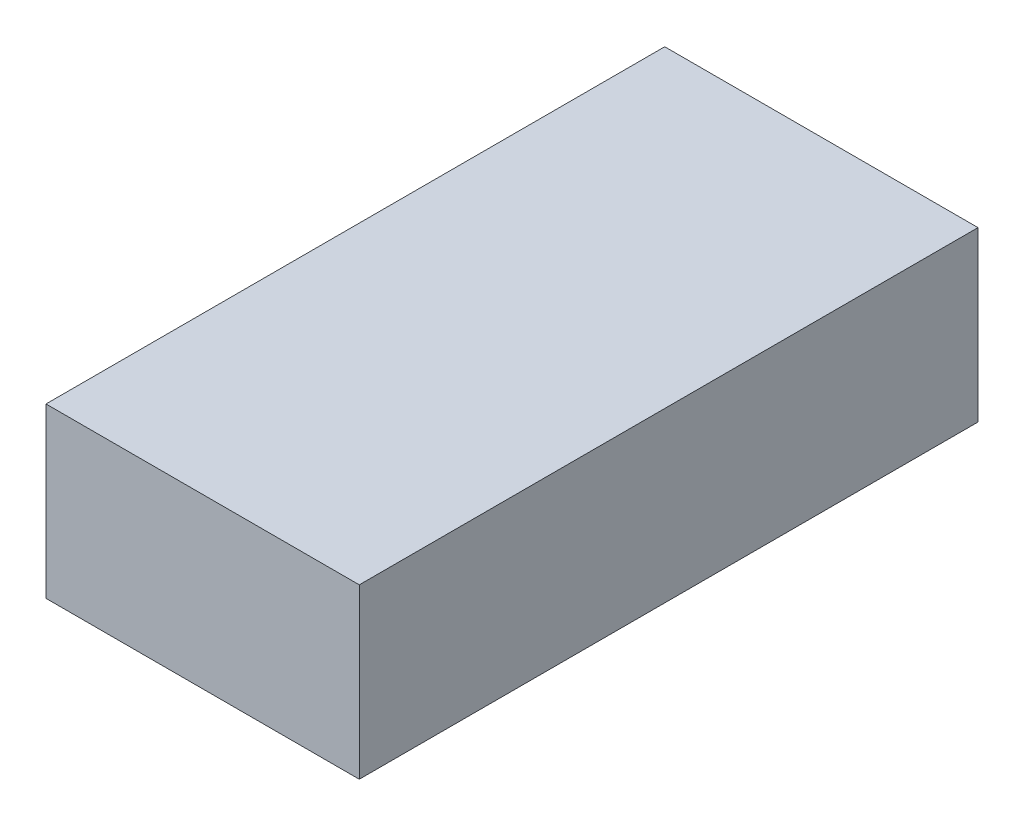
ISO-10303-21;
HEADER;
FILE_DESCRIPTION(('STEP AP214'),'2;1');
FILE_NAME('part.step','',(''),(''),'','','');
FILE_SCHEMA(('AUTOMOTIVE_DESIGN { 1 0 10303 214 1 1 1 1 }'));
ENDSEC;
DATA;
#1=APPLICATION_CONTEXT('core data for automotive mechanical design processes');
#2=APPLICATION_PROTOCOL_DEFINITION('international standard','automotive_design',2000,#1);
#3=PRODUCT_CONTEXT('',#1,'mechanical');
#4=PRODUCT('Part','Part','',(#3));
#5=PRODUCT_RELATED_PRODUCT_CATEGORY('part','',(#4));
#6=PRODUCT_DEFINITION_FORMATION('','',#4);
#7=PRODUCT_DEFINITION_CONTEXT('part definition',#1,'design');
#8=PRODUCT_DEFINITION('design','',#6,#7);
#9=PRODUCT_DEFINITION_SHAPE('','',#8);
#10=(LENGTH_UNIT() NAMED_UNIT(*) SI_UNIT(.MILLI.,.METRE.));
#11=(NAMED_UNIT(*) PLANE_ANGLE_UNIT() SI_UNIT($,.RADIAN.));
#12=(NAMED_UNIT(*) SI_UNIT($,.STERADIAN.) SOLID_ANGLE_UNIT());
#13=UNCERTAINTY_MEASURE_WITH_UNIT(LENGTH_MEASURE(1.E-05),#10,'distance_accuracy_value','');
#14=(GEOMETRIC_REPRESENTATION_CONTEXT(3) GLOBAL_UNCERTAINTY_ASSIGNED_CONTEXT((#13)) GLOBAL_UNIT_ASSIGNED_CONTEXT((#10,
#11,#12)) REPRESENTATION_CONTEXT('',''));
#15=CARTESIAN_POINT('',(0.,0.,0.));
#16=DIRECTION('',(0.,0.,1.));
#17=DIRECTION('',(1.,0.,0.));
#18=AXIS2_PLACEMENT_3D('',#15,#16,#17);
#19=CARTESIAN_POINT('',(2.03746755693052,0.215,0.79));
#20=DIRECTION('',(0.,0.,-1.));
#21=DIRECTION('',(-1.,0.,0.));
#22=AXIS2_PLACEMENT_3D('',#19,#20,#21);
#23=PLANE('',#22);
#24=DIRECTION('',(0.,-1.,0.));
#25=VECTOR('',#24,1.);
#26=CARTESIAN_POINT('',(0.4,0.215,0.79));
#27=LINE('',#26,#25);
#28=CARTESIAN_POINT('',(0.4,0.215,0.79));
#29=VERTEX_POINT('',#28);
#30=CARTESIAN_POINT('',(0.4,-0.215,0.79));
#31=VERTEX_POINT('',#30);
#32=EDGE_CURVE('E11',#29,#31,#27,.T.);
#33=ORIENTED_EDGE('',*,*,#32,.F.);
#34=DIRECTION('',(-1.,0.,0.));
#35=VECTOR('',#34,1.);
#36=CARTESIAN_POINT('',(2.03746755693052,0.215,0.79));
#37=LINE('',#36,#35);
#38=CARTESIAN_POINT('',(-0.4,0.215,0.79));
#39=VERTEX_POINT('',#38);
#40=EDGE_CURVE('E23',#29,#39,#37,.T.);
#41=ORIENTED_EDGE('',*,*,#40,.T.);
#42=DIRECTION('',(0.,1.,0.));
#43=VECTOR('',#42,1.);
#44=CARTESIAN_POINT('',(-0.4,0.215,0.79));
#45=LINE('',#44,#43);
#46=CARTESIAN_POINT('',(-0.4,-0.215,0.79));
#47=VERTEX_POINT('',#46);
#48=EDGE_CURVE('E74',#47,#39,#45,.T.);
#49=ORIENTED_EDGE('',*,*,#48,.F.);
#50=DIRECTION('',(-1.,0.,0.));
#51=VECTOR('',#50,1.);
#52=CARTESIAN_POINT('',(2.03746755693052,-0.215,0.79));
#53=LINE('',#52,#51);
#54=EDGE_CURVE('E84',#31,#47,#53,.T.);
#55=ORIENTED_EDGE('',*,*,#54,.F.);
#56=EDGE_LOOP('',(#33,#41,#49,#55));
#57=FACE_BOUND('',#56,.T.);
#58=ADVANCED_FACE('F16',(#57),#23,.F.);
#59=CARTESIAN_POINT('',(2.03746755693052,-0.215,0.79));
#60=DIRECTION('',(0.,1.,0.));
#61=DIRECTION('',(0.,0.,1.));
#62=AXIS2_PLACEMENT_3D('',#59,#60,#61);
#63=PLANE('',#62);
#64=DIRECTION('',(0.,0.,-1.));
#65=VECTOR('',#64,1.);
#66=CARTESIAN_POINT('',(0.4,-0.215,0.79));
#67=LINE('',#66,#65);
#68=CARTESIAN_POINT('',(0.4,-0.215,-0.79));
#69=VERTEX_POINT('',#68);
#70=EDGE_CURVE('E82',#31,#69,#67,.T.);
#71=ORIENTED_EDGE('',*,*,#70,.F.);
#72=ORIENTED_EDGE('',*,*,#54,.T.);
#73=DIRECTION('',(0.,0.,1.));
#74=VECTOR('',#73,1.);
#75=CARTESIAN_POINT('',(-0.4,-0.215,0.79));
#76=LINE('',#75,#74);
#77=CARTESIAN_POINT('',(-0.4,-0.215,-0.79));
#78=VERTEX_POINT('',#77);
#79=EDGE_CURVE('E80',#78,#47,#76,.T.);
#80=ORIENTED_EDGE('',*,*,#79,.F.);
#81=DIRECTION('',(-1.,0.,0.));
#82=VECTOR('',#81,1.);
#83=CARTESIAN_POINT('',(2.03746755693052,-0.215,-0.79));
#84=LINE('',#83,#82);
#85=EDGE_CURVE('E60',#69,#78,#84,.T.);
#86=ORIENTED_EDGE('',*,*,#85,.F.);
#87=EDGE_LOOP('',(#71,#72,#80,#86));
#88=FACE_BOUND('',#87,.T.);
#89=ADVANCED_FACE('F90',(#88),#63,.F.);
#90=CARTESIAN_POINT('',(2.03746755693052,0.215,-0.79));
#91=DIRECTION('',(0.,0.,1.));
#92=DIRECTION('',(1.,0.,0.));
#93=AXIS2_PLACEMENT_3D('',#90,#91,#92);
#94=PLANE('',#93);
#95=DIRECTION('',(0.,1.,0.));
#96=VECTOR('',#95,1.);
#97=CARTESIAN_POINT('',(0.4,0.215,-0.79));
#98=LINE('',#97,#96);
#99=CARTESIAN_POINT('',(0.4,0.215,-0.79));
#100=VERTEX_POINT('',#99);
#101=EDGE_CURVE('E64',#69,#100,#98,.T.);
#102=ORIENTED_EDGE('',*,*,#101,.F.);
#103=ORIENTED_EDGE('',*,*,#85,.T.);
#104=DIRECTION('',(0.,-1.,0.));
#105=VECTOR('',#104,1.);
#106=CARTESIAN_POINT('',(-0.4,0.215,-0.79));
#107=LINE('',#106,#105);
#108=CARTESIAN_POINT('',(-0.4,0.215,-0.79));
#109=VERTEX_POINT('',#108);
#110=EDGE_CURVE('E53',#109,#78,#107,.T.);
#111=ORIENTED_EDGE('',*,*,#110,.F.);
#112=DIRECTION('',(-1.,0.,0.));
#113=VECTOR('',#112,1.);
#114=CARTESIAN_POINT('',(2.03746755693052,0.215,-0.79));
#115=LINE('',#114,#113);
#116=EDGE_CURVE('E57',#100,#109,#115,.T.);
#117=ORIENTED_EDGE('',*,*,#116,.F.);
#118=EDGE_LOOP('',(#102,#103,#111,#117));
#119=FACE_BOUND('',#118,.T.);
#120=ADVANCED_FACE('F56',(#119),#94,.F.);
#121=CARTESIAN_POINT('',(2.03746755693052,0.215,0.79));
#122=DIRECTION('',(0.,-1.,0.));
#123=DIRECTION('',(0.,0.,-1.));
#124=AXIS2_PLACEMENT_3D('',#121,#122,#123);
#125=PLANE('',#124);
#126=DIRECTION('',(0.,0.,1.));
#127=VECTOR('',#126,1.);
#128=CARTESIAN_POINT('',(0.4,0.215,0.79));
#129=LINE('',#128,#127);
#130=EDGE_CURVE('E70',#100,#29,#129,.T.);
#131=ORIENTED_EDGE('',*,*,#130,.F.);
#132=ORIENTED_EDGE('',*,*,#116,.T.);
#133=DIRECTION('',(0.,0.,-1.));
#134=VECTOR('',#133,1.);
#135=CARTESIAN_POINT('',(-0.4,0.215,0.79));
#136=LINE('',#135,#134);
#137=EDGE_CURVE('E69',#39,#109,#136,.T.);
#138=ORIENTED_EDGE('',*,*,#137,.F.);
#139=ORIENTED_EDGE('',*,*,#40,.F.);
#140=EDGE_LOOP('',(#131,#132,#138,#139));
#141=FACE_BOUND('',#140,.T.);
#142=ADVANCED_FACE('F68',(#141),#125,.F.);
#143=CARTESIAN_POINT('',(0.4,0.225,0.8));
#144=DIRECTION('',(1.,0.,0.));
#145=DIRECTION('',(0.,0.,-1.));
#146=AXIS2_PLACEMENT_3D('',#143,#144,#145);
#147=PLANE('',#146);
#148=ORIENTED_EDGE('',*,*,#130,.T.);
#149=ORIENTED_EDGE('',*,*,#32,.T.);
#150=ORIENTED_EDGE('',*,*,#70,.T.);
#151=ORIENTED_EDGE('',*,*,#101,.T.);
#152=EDGE_LOOP('',(#148,#149,#150,#151));
#153=FACE_BOUND('',#152,.T.);
#154=ADVANCED_FACE('F87',(#153),#147,.T.);
#155=CARTESIAN_POINT('',(-0.4,0.225,0.8));
#156=DIRECTION('',(1.,0.,0.));
#157=DIRECTION('',(0.,0.,-1.));
#158=AXIS2_PLACEMENT_3D('',#155,#156,#157);
#159=PLANE('',#158);
#160=ORIENTED_EDGE('',*,*,#48,.T.);
#161=ORIENTED_EDGE('',*,*,#137,.T.);
#162=ORIENTED_EDGE('',*,*,#110,.T.);
#163=ORIENTED_EDGE('',*,*,#79,.T.);
#164=EDGE_LOOP('',(#160,#161,#162,#163));
#165=FACE_BOUND('',#164,.T.);
#166=ADVANCED_FACE('F73',(#165),#159,.F.);
#167=CLOSED_SHELL('',(#58,#89,#120,#142,#154,#166));
#168=MANIFOLD_SOLID_BREP('B1',#167);
#169=ADVANCED_BREP_SHAPE_REPRESENTATION('',(#18,#168),#14);
#170=SHAPE_DEFINITION_REPRESENTATION(#9,#169);
ENDSEC;
END-ISO-10303-21;
